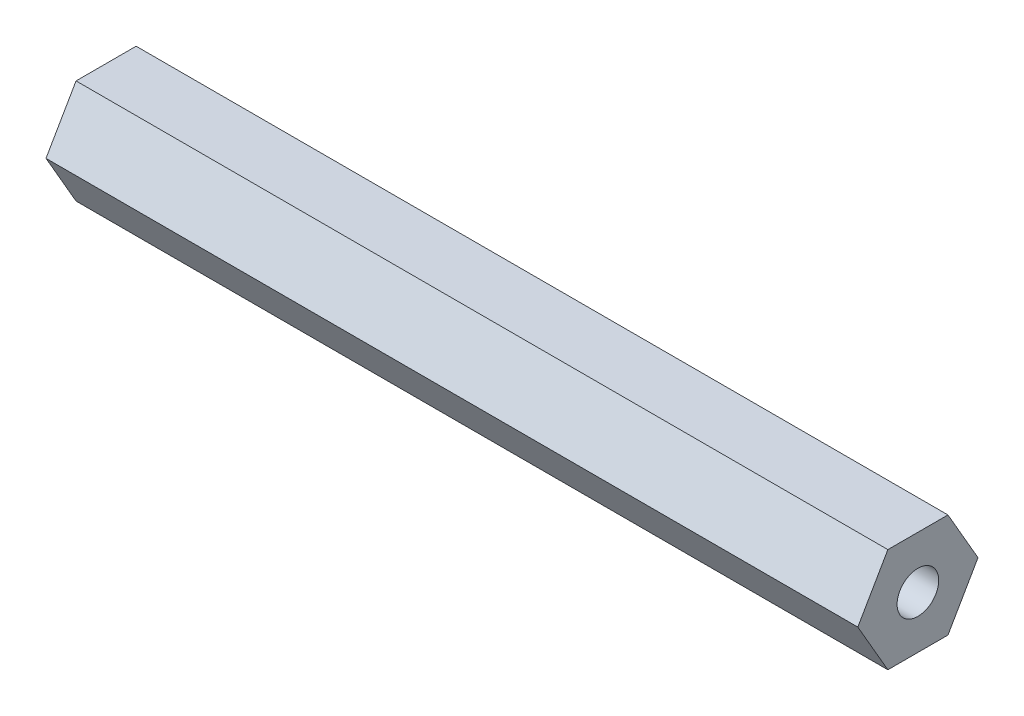
ISO-10303-21;
HEADER;
FILE_DESCRIPTION(('STEP AP214'),'2;1');
FILE_NAME('part.step','',(''),(''),'','','');
FILE_SCHEMA(('AUTOMOTIVE_DESIGN { 1 0 10303 214 1 1 1 1 }'));
ENDSEC;
DATA;
#1=APPLICATION_CONTEXT('core data for automotive mechanical design processes');
#2=APPLICATION_PROTOCOL_DEFINITION('international standard','automotive_design',2000,#1);
#3=PRODUCT_CONTEXT('',#1,'mechanical');
#4=PRODUCT('Part','Part','',(#3));
#5=PRODUCT_RELATED_PRODUCT_CATEGORY('part','',(#4));
#6=PRODUCT_DEFINITION_FORMATION('','',#4);
#7=PRODUCT_DEFINITION_CONTEXT('part definition',#1,'design');
#8=PRODUCT_DEFINITION('design','',#6,#7);
#9=PRODUCT_DEFINITION_SHAPE('','',#8);
#10=(LENGTH_UNIT() NAMED_UNIT(*) SI_UNIT(.MILLI.,.METRE.));
#11=(NAMED_UNIT(*) PLANE_ANGLE_UNIT() SI_UNIT($,.RADIAN.));
#12=(NAMED_UNIT(*) SI_UNIT($,.STERADIAN.) SOLID_ANGLE_UNIT());
#13=UNCERTAINTY_MEASURE_WITH_UNIT(LENGTH_MEASURE(1.E-05),#10,'distance_accuracy_value','');
#14=(GEOMETRIC_REPRESENTATION_CONTEXT(3) GLOBAL_UNCERTAINTY_ASSIGNED_CONTEXT((#13)) GLOBAL_UNIT_ASSIGNED_CONTEXT((#10,
#11,#12)) REPRESENTATION_CONTEXT('',''));
#15=CARTESIAN_POINT('',(0.,0.,0.));
#16=DIRECTION('',(0.,0.,1.));
#17=DIRECTION('',(1.,0.,0.));
#18=AXIS2_PLACEMENT_3D('',#15,#16,#17);
#19=CARTESIAN_POINT('',(39.,0.,0.));
#20=DIRECTION('',(1.,0.,0.));
#21=DIRECTION('',(0.,0.,-1.));
#22=AXIS2_PLACEMENT_3D('',#19,#20,#21);
#23=PLANE('',#22);
#24=DIRECTION('',(0.,0.866025403784441,-0.499999999999995));
#25=VECTOR('',#24,1.);
#26=CARTESIAN_POINT('',(39.,-2.49999999999997,-1.44337567297409));
#27=LINE('',#26,#25);
#28=CARTESIAN_POINT('',(39.,-2.49999999999997,-1.44337567297409));
#29=VERTEX_POINT('',#28);
#30=CARTESIAN_POINT('',(39.,0.,-2.88675134594811));
#31=VERTEX_POINT('',#30);
#32=EDGE_CURVE('E139',#29,#31,#27,.T.);
#33=ORIENTED_EDGE('',*,*,#32,.T.);
#34=DIRECTION('',(0.,0.866025403784438,0.500000000000001));
#35=VECTOR('',#34,1.);
#36=CARTESIAN_POINT('',(39.,0.,-2.88675134594811));
#37=LINE('',#36,#35);
#38=CARTESIAN_POINT('',(39.,2.49999999999999,-1.44337567297405));
#39=VERTEX_POINT('',#38);
#40=EDGE_CURVE('E97',#31,#39,#37,.T.);
#41=ORIENTED_EDGE('',*,*,#40,.T.);
#42=DIRECTION('',(0.,0.,1.));
#43=VECTOR('',#42,1.);
#44=CARTESIAN_POINT('',(39.,2.49999999999999,-1.44337567297405));
#45=LINE('',#44,#43);
#46=CARTESIAN_POINT('',(39.,2.49999999999998,1.44337567297407));
#47=VERTEX_POINT('',#46);
#48=EDGE_CURVE('E110',#39,#47,#45,.T.);
#49=ORIENTED_EDGE('',*,*,#48,.T.);
#50=DIRECTION('',(0.,-0.866025403784441,0.499999999999995));
#51=VECTOR('',#50,1.);
#52=CARTESIAN_POINT('',(39.,2.49999999999998,1.44337567297407));
#53=LINE('',#52,#51);
#54=CARTESIAN_POINT('',(39.,0.,2.88675134594811));
#55=VERTEX_POINT('',#54);
#56=EDGE_CURVE('E104',#47,#55,#53,.T.);
#57=ORIENTED_EDGE('',*,*,#56,.T.);
#58=DIRECTION('',(0.,-0.866025403784435,-0.500000000000007));
#59=VECTOR('',#58,1.);
#60=CARTESIAN_POINT('',(39.,0.,2.88675134594811));
#61=LINE('',#60,#59);
#62=CARTESIAN_POINT('',(39.,-2.5,1.44337567297403));
#63=VERTEX_POINT('',#62);
#64=EDGE_CURVE('E108',#55,#63,#61,.T.);
#65=ORIENTED_EDGE('',*,*,#64,.T.);
#66=DIRECTION('',(0.,0.,-1.));
#67=VECTOR('',#66,1.);
#68=CARTESIAN_POINT('',(39.,-2.5,1.44337567297403));
#69=LINE('',#68,#67);
#70=EDGE_CURVE('E60',#63,#29,#69,.T.);
#71=ORIENTED_EDGE('',*,*,#70,.T.);
#72=EDGE_LOOP('',(#33,#41,#49,#57,#65,#71));
#73=FACE_BOUND('',#72,.T.);
#74=CARTESIAN_POINT('',(39.,0.,0.));
#75=DIRECTION('',(1.,0.,0.));
#76=DIRECTION('',(0.,0.,-1.));
#77=AXIS2_PLACEMENT_3D('',#74,#75,#76);
#78=CIRCLE('',#77,1.);
#79=CARTESIAN_POINT('',(39.,0.,-1.));
#80=VERTEX_POINT('',#79);
#81=EDGE_CURVE('E132',#80,#80,#78,.T.);
#82=ORIENTED_EDGE('',*,*,#81,.F.);
#83=EDGE_LOOP('',(#82));
#84=FACE_BOUND('',#83,.T.);
#85=ADVANCED_FACE('F43',(#73,#84),#23,.T.);
#86=CARTESIAN_POINT('',(0.,0.,0.));
#87=DIRECTION('',(1.,0.,0.));
#88=DIRECTION('',(0.,0.,-1.));
#89=AXIS2_PLACEMENT_3D('',#86,#87,#88);
#90=PLANE('',#89);
#91=DIRECTION('',(0.,0.866025403784441,-0.499999999999995));
#92=VECTOR('',#91,1.);
#93=CARTESIAN_POINT('',(0.,-2.49999999999997,-1.44337567297409));
#94=LINE('',#93,#92);
#95=CARTESIAN_POINT('',(0.,-2.49999999999997,-1.44337567297409));
#96=VERTEX_POINT('',#95);
#97=CARTESIAN_POINT('',(0.,0.,-2.88675134594811));
#98=VERTEX_POINT('',#97);
#99=EDGE_CURVE('E128',#96,#98,#94,.T.);
#100=ORIENTED_EDGE('',*,*,#99,.F.);
#101=DIRECTION('',(0.,0.,-1.));
#102=VECTOR('',#101,1.);
#103=CARTESIAN_POINT('',(0.,-2.5,1.44337567297403));
#104=LINE('',#103,#102);
#105=CARTESIAN_POINT('',(0.,-2.5,1.44337567297403));
#106=VERTEX_POINT('',#105);
#107=EDGE_CURVE('E89',#106,#96,#104,.T.);
#108=ORIENTED_EDGE('',*,*,#107,.F.);
#109=DIRECTION('',(0.,-0.866025403784435,-0.500000000000007));
#110=VECTOR('',#109,1.);
#111=CARTESIAN_POINT('',(0.,0.,2.88675134594811));
#112=LINE('',#111,#110);
#113=CARTESIAN_POINT('',(0.,0.,2.88675134594811));
#114=VERTEX_POINT('',#113);
#115=EDGE_CURVE('E83',#114,#106,#112,.T.);
#116=ORIENTED_EDGE('',*,*,#115,.F.);
#117=DIRECTION('',(0.,-0.866025403784441,0.499999999999995));
#118=VECTOR('',#117,1.);
#119=CARTESIAN_POINT('',(0.,2.49999999999998,1.44337567297407));
#120=LINE('',#119,#118);
#121=CARTESIAN_POINT('',(0.,2.49999999999998,1.44337567297407));
#122=VERTEX_POINT('',#121);
#123=EDGE_CURVE('E118',#122,#114,#120,.T.);
#124=ORIENTED_EDGE('',*,*,#123,.F.);
#125=DIRECTION('',(0.,0.,1.));
#126=VECTOR('',#125,1.);
#127=CARTESIAN_POINT('',(0.,2.49999999999999,-1.44337567297405));
#128=LINE('',#127,#126);
#129=CARTESIAN_POINT('',(0.,2.49999999999999,-1.44337567297405));
#130=VERTEX_POINT('',#129);
#131=EDGE_CURVE('E134',#130,#122,#128,.T.);
#132=ORIENTED_EDGE('',*,*,#131,.F.);
#133=DIRECTION('',(0.,0.866025403784438,0.500000000000001));
#134=VECTOR('',#133,1.);
#135=CARTESIAN_POINT('',(0.,0.,-2.88675134594811));
#136=LINE('',#135,#134);
#137=EDGE_CURVE('E131',#98,#130,#136,.T.);
#138=ORIENTED_EDGE('',*,*,#137,.F.);
#139=EDGE_LOOP('',(#100,#108,#116,#124,#132,#138));
#140=FACE_BOUND('',#139,.T.);
#141=CARTESIAN_POINT('',(0.,0.,0.));
#142=DIRECTION('',(1.,0.,0.));
#143=DIRECTION('',(0.,0.,-1.));
#144=AXIS2_PLACEMENT_3D('',#141,#142,#143);
#145=CIRCLE('',#144,1.);
#146=CARTESIAN_POINT('',(0.,0.,-1.));
#147=VERTEX_POINT('',#146);
#148=EDGE_CURVE('E232',#147,#147,#145,.T.);
#149=ORIENTED_EDGE('',*,*,#148,.T.);
#150=EDGE_LOOP('',(#149));
#151=FACE_BOUND('',#150,.T.);
#152=ADVANCED_FACE('F148',(#140,#151),#90,.F.);
#153=CARTESIAN_POINT('',(39.,-2.49999999999997,-1.44337567297409));
#154=DIRECTION('',(0.,0.499999999999995,0.866025403784442));
#155=DIRECTION('',(0.,-0.866025403784441,0.499999999999995));
#156=AXIS2_PLACEMENT_3D('',#153,#154,#155);
#157=PLANE('',#156);
#158=ORIENTED_EDGE('',*,*,#99,.T.);
#159=DIRECTION('',(-1.,0.,0.));
#160=VECTOR('',#159,1.);
#161=CARTESIAN_POINT('',(39.,0.,-2.88675134594811));
#162=LINE('',#161,#160);
#163=EDGE_CURVE('E11',#31,#98,#162,.T.);
#164=ORIENTED_EDGE('',*,*,#163,.F.);
#165=ORIENTED_EDGE('',*,*,#32,.F.);
#166=DIRECTION('',(-1.,0.,0.));
#167=VECTOR('',#166,1.);
#168=CARTESIAN_POINT('',(39.,-2.49999999999997,-1.44337567297409));
#169=LINE('',#168,#167);
#170=EDGE_CURVE('E124',#29,#96,#169,.T.);
#171=ORIENTED_EDGE('',*,*,#170,.T.);
#172=EDGE_LOOP('',(#158,#164,#165,#171));
#173=FACE_BOUND('',#172,.T.);
#174=ADVANCED_FACE('F45',(#173),#157,.F.);
#175=CARTESIAN_POINT('',(39.,0.,-2.88675134594811));
#176=DIRECTION('',(0.,-0.500000000000001,0.866025403784438));
#177=DIRECTION('',(0.,-0.866025403784438,-0.500000000000001));
#178=AXIS2_PLACEMENT_3D('',#175,#176,#177);
#179=PLANE('',#178);
#180=ORIENTED_EDGE('',*,*,#137,.T.);
#181=DIRECTION('',(-1.,0.,0.));
#182=VECTOR('',#181,1.);
#183=CARTESIAN_POINT('',(39.,2.49999999999999,-1.44337567297405));
#184=LINE('',#183,#182);
#185=EDGE_CURVE('E52',#39,#130,#184,.T.);
#186=ORIENTED_EDGE('',*,*,#185,.F.);
#187=ORIENTED_EDGE('',*,*,#40,.F.);
#188=ORIENTED_EDGE('',*,*,#163,.T.);
#189=EDGE_LOOP('',(#180,#186,#187,#188));
#190=FACE_BOUND('',#189,.T.);
#191=ADVANCED_FACE('F173',(#190),#179,.F.);
#192=CARTESIAN_POINT('',(39.,2.49999999999999,-1.44337567297405));
#193=DIRECTION('',(0.,-1.,0.));
#194=DIRECTION('',(0.,0.,-1.));
#195=AXIS2_PLACEMENT_3D('',#192,#193,#194);
#196=PLANE('',#195);
#197=ORIENTED_EDGE('',*,*,#131,.T.);
#198=DIRECTION('',(-1.,0.,0.));
#199=VECTOR('',#198,1.);
#200=CARTESIAN_POINT('',(39.,2.49999999999998,1.44337567297407));
#201=LINE('',#200,#199);
#202=EDGE_CURVE('E119',#47,#122,#201,.T.);
#203=ORIENTED_EDGE('',*,*,#202,.F.);
#204=ORIENTED_EDGE('',*,*,#48,.F.);
#205=ORIENTED_EDGE('',*,*,#185,.T.);
#206=EDGE_LOOP('',(#197,#203,#204,#205));
#207=FACE_BOUND('',#206,.T.);
#208=ADVANCED_FACE('F145',(#207),#196,.F.);
#209=CARTESIAN_POINT('',(39.,2.49999999999998,1.44337567297407));
#210=DIRECTION('',(0.,-0.499999999999995,-0.866025403784442));
#211=DIRECTION('',(0.,0.866025403784442,-0.499999999999995));
#212=AXIS2_PLACEMENT_3D('',#209,#210,#211);
#213=PLANE('',#212);
#214=ORIENTED_EDGE('',*,*,#123,.T.);
#215=DIRECTION('',(-1.,0.,0.));
#216=VECTOR('',#215,1.);
#217=CARTESIAN_POINT('',(39.,0.,2.88675134594811));
#218=LINE('',#217,#216);
#219=EDGE_CURVE('E115',#55,#114,#218,.T.);
#220=ORIENTED_EDGE('',*,*,#219,.F.);
#221=ORIENTED_EDGE('',*,*,#56,.F.);
#222=ORIENTED_EDGE('',*,*,#202,.T.);
#223=EDGE_LOOP('',(#214,#220,#221,#222));
#224=FACE_BOUND('',#223,.T.);
#225=ADVANCED_FACE('F116',(#224),#213,.F.);
#226=CARTESIAN_POINT('',(39.,0.,2.88675134594811));
#227=DIRECTION('',(0.,0.500000000000007,-0.866025403784435));
#228=DIRECTION('',(0.,0.866025403784434,0.500000000000007));
#229=AXIS2_PLACEMENT_3D('',#226,#227,#228);
#230=PLANE('',#229);
#231=ORIENTED_EDGE('',*,*,#115,.T.);
#232=DIRECTION('',(-1.,0.,0.));
#233=VECTOR('',#232,1.);
#234=CARTESIAN_POINT('',(39.,-2.5,1.44337567297403));
#235=LINE('',#234,#233);
#236=EDGE_CURVE('E120',#63,#106,#235,.T.);
#237=ORIENTED_EDGE('',*,*,#236,.F.);
#238=ORIENTED_EDGE('',*,*,#64,.F.);
#239=ORIENTED_EDGE('',*,*,#219,.T.);
#240=EDGE_LOOP('',(#231,#237,#238,#239));
#241=FACE_BOUND('',#240,.T.);
#242=ADVANCED_FACE('F122',(#241),#230,.F.);
#243=CARTESIAN_POINT('',(39.,-2.5,1.44337567297403));
#244=DIRECTION('',(0.,1.,0.));
#245=DIRECTION('',(0.,0.,1.));
#246=AXIS2_PLACEMENT_3D('',#243,#244,#245);
#247=PLANE('',#246);
#248=ORIENTED_EDGE('',*,*,#107,.T.);
#249=ORIENTED_EDGE('',*,*,#170,.F.);
#250=ORIENTED_EDGE('',*,*,#70,.F.);
#251=ORIENTED_EDGE('',*,*,#236,.T.);
#252=EDGE_LOOP('',(#248,#249,#250,#251));
#253=FACE_BOUND('',#252,.T.);
#254=ADVANCED_FACE('F153',(#253),#247,.F.);
#255=CARTESIAN_POINT('',(39.,0.,0.));
#256=DIRECTION('',(-1.,0.,0.));
#257=DIRECTION('',(0.,0.,1.));
#258=AXIS2_PLACEMENT_3D('',#255,#256,#257);
#259=CYLINDRICAL_SURFACE('',#258,1.);
#260=ORIENTED_EDGE('',*,*,#81,.T.);
#261=EDGE_LOOP('',(#260));
#262=FACE_BOUND('',#261,.T.);
#263=ORIENTED_EDGE('',*,*,#148,.F.);
#264=EDGE_LOOP('',(#263));
#265=FACE_BOUND('',#264,.T.);
#266=ADVANCED_FACE('F155',(#262,#265),#259,.F.);
#267=CLOSED_SHELL('',(#85,#152,#174,#191,#208,#225,#242,#254,#266));
#268=MANIFOLD_SOLID_BREP('B2',#267);
#269=ADVANCED_BREP_SHAPE_REPRESENTATION('',(#18,#268),#14);
#270=SHAPE_DEFINITION_REPRESENTATION(#9,#269);
ENDSEC;
END-ISO-10303-21;
